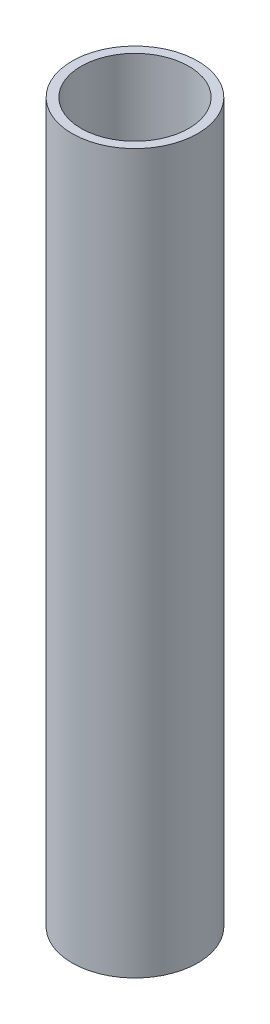
ISO-10303-21;
HEADER;
FILE_DESCRIPTION(('STEP AP214'),'2;1');
FILE_NAME('part.step','',(''),(''),'','','');
FILE_SCHEMA(('AUTOMOTIVE_DESIGN { 1 0 10303 214 1 1 1 1 }'));
ENDSEC;
DATA;
#1=APPLICATION_CONTEXT('core data for automotive mechanical design processes');
#2=APPLICATION_PROTOCOL_DEFINITION('international standard','automotive_design',2000,#1);
#3=PRODUCT_CONTEXT('',#1,'mechanical');
#4=PRODUCT('Part','Part','',(#3));
#5=PRODUCT_RELATED_PRODUCT_CATEGORY('part','',(#4));
#6=PRODUCT_DEFINITION_FORMATION('','',#4);
#7=PRODUCT_DEFINITION_CONTEXT('part definition',#1,'design');
#8=PRODUCT_DEFINITION('design','',#6,#7);
#9=PRODUCT_DEFINITION_SHAPE('','',#8);
#10=(LENGTH_UNIT() NAMED_UNIT(*) SI_UNIT(.MILLI.,.METRE.));
#11=(NAMED_UNIT(*) PLANE_ANGLE_UNIT() SI_UNIT($,.RADIAN.));
#12=(NAMED_UNIT(*) SI_UNIT($,.STERADIAN.) SOLID_ANGLE_UNIT());
#13=UNCERTAINTY_MEASURE_WITH_UNIT(LENGTH_MEASURE(1.E-05),#10,'distance_accuracy_value','');
#14=(GEOMETRIC_REPRESENTATION_CONTEXT(3) GLOBAL_UNCERTAINTY_ASSIGNED_CONTEXT((#13)) GLOBAL_UNIT_ASSIGNED_CONTEXT((#10,
#11,#12)) REPRESENTATION_CONTEXT('',''));
#15=CARTESIAN_POINT('',(0.,0.,0.));
#16=DIRECTION('',(0.,0.,1.));
#17=DIRECTION('',(1.,0.,0.));
#18=AXIS2_PLACEMENT_3D('',#15,#16,#17);
#19=CARTESIAN_POINT('',(0.,800.,0.));
#20=DIRECTION('',(0.,1.,0.));
#21=DIRECTION('',(0.,0.,1.));
#22=AXIS2_PLACEMENT_3D('',#19,#20,#21);
#23=PLANE('',#22);
#24=CARTESIAN_POINT('',(0.,800.,0.));
#25=DIRECTION('',(0.,1.,0.));
#26=DIRECTION('',(0.,0.,1.));
#27=AXIS2_PLACEMENT_3D('',#24,#25,#26);
#28=CIRCLE('',#27,70.);
#29=CARTESIAN_POINT('',(0.,800.,70.));
#30=VERTEX_POINT('',#29);
#31=EDGE_CURVE('E10',#30,#30,#28,.T.);
#32=ORIENTED_EDGE('',*,*,#31,.T.);
#33=EDGE_LOOP('',(#32));
#34=FACE_BOUND('',#33,.T.);
#35=CARTESIAN_POINT('',(0.,800.,0.));
#36=DIRECTION('',(0.,1.,0.));
#37=DIRECTION('',(0.,0.,1.));
#38=AXIS2_PLACEMENT_3D('',#35,#36,#37);
#39=CIRCLE('',#38,60.);
#40=CARTESIAN_POINT('',(0.,800.,60.));
#41=VERTEX_POINT('',#40);
#42=EDGE_CURVE('E41',#41,#41,#39,.T.);
#43=ORIENTED_EDGE('',*,*,#42,.F.);
#44=EDGE_LOOP('',(#43));
#45=FACE_BOUND('',#44,.T.);
#46=ADVANCED_FACE('F30',(#34,#45),#23,.T.);
#47=CARTESIAN_POINT('',(0.,0.,0.));
#48=DIRECTION('',(0.,1.,0.));
#49=DIRECTION('',(0.,0.,1.));
#50=AXIS2_PLACEMENT_3D('',#47,#48,#49);
#51=PLANE('',#50);
#52=CARTESIAN_POINT('',(0.,0.,0.));
#53=DIRECTION('',(0.,1.,0.));
#54=DIRECTION('',(0.,0.,1.));
#55=AXIS2_PLACEMENT_3D('',#52,#53,#54);
#56=CIRCLE('',#55,70.);
#57=CARTESIAN_POINT('',(0.,0.,70.));
#58=VERTEX_POINT('',#57);
#59=EDGE_CURVE('E34',#58,#58,#56,.T.);
#60=ORIENTED_EDGE('',*,*,#59,.F.);
#61=EDGE_LOOP('',(#60));
#62=FACE_BOUND('',#61,.T.);
#63=CARTESIAN_POINT('',(0.,0.,0.));
#64=DIRECTION('',(0.,1.,0.));
#65=DIRECTION('',(0.,0.,1.));
#66=AXIS2_PLACEMENT_3D('',#63,#64,#65);
#67=CIRCLE('',#66,60.);
#68=CARTESIAN_POINT('',(0.,0.,60.));
#69=VERTEX_POINT('',#68);
#70=EDGE_CURVE('E43',#69,#69,#67,.T.);
#71=ORIENTED_EDGE('',*,*,#70,.T.);
#72=EDGE_LOOP('',(#71));
#73=FACE_BOUND('',#72,.T.);
#74=ADVANCED_FACE('F53',(#62,#73),#51,.F.);
#75=CARTESIAN_POINT('',(0.,800.,0.));
#76=DIRECTION('',(0.,-1.,0.));
#77=DIRECTION('',(0.,0.,-1.));
#78=AXIS2_PLACEMENT_3D('',#75,#76,#77);
#79=CYLINDRICAL_SURFACE('',#78,70.);
#80=ORIENTED_EDGE('',*,*,#31,.F.);
#81=EDGE_LOOP('',(#80));
#82=FACE_BOUND('',#81,.T.);
#83=ORIENTED_EDGE('',*,*,#59,.T.);
#84=EDGE_LOOP('',(#83));
#85=FACE_BOUND('',#84,.T.);
#86=ADVANCED_FACE('F32',(#82,#85),#79,.T.);
#87=CARTESIAN_POINT('',(0.,800.,0.));
#88=DIRECTION('',(0.,-1.,0.));
#89=DIRECTION('',(0.,0.,-1.));
#90=AXIS2_PLACEMENT_3D('',#87,#88,#89);
#91=CYLINDRICAL_SURFACE('',#90,60.);
#92=ORIENTED_EDGE('',*,*,#42,.T.);
#93=EDGE_LOOP('',(#92));
#94=FACE_BOUND('',#93,.T.);
#95=ORIENTED_EDGE('',*,*,#70,.F.);
#96=EDGE_LOOP('',(#95));
#97=FACE_BOUND('',#96,.T.);
#98=ADVANCED_FACE('F49',(#94,#97),#91,.F.);
#99=CLOSED_SHELL('',(#46,#74,#86,#98));
#100=MANIFOLD_SOLID_BREP('B2',#99);
#101=ADVANCED_BREP_SHAPE_REPRESENTATION('',(#18,#100),#14);
#102=SHAPE_DEFINITION_REPRESENTATION(#9,#101);
ENDSEC;
END-ISO-10303-21;
